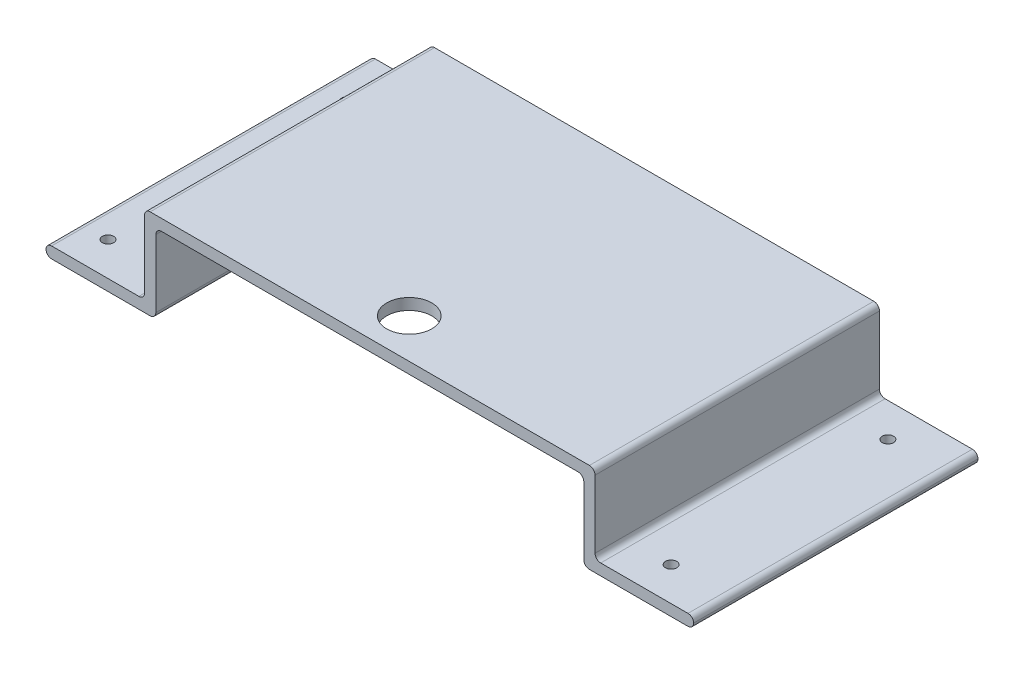
ISO-10303-21;
HEADER;
FILE_DESCRIPTION(('STEP AP214'),'2;1');
FILE_NAME('part.step','',(''),(''),'','','');
FILE_SCHEMA(('AUTOMOTIVE_DESIGN { 1 0 10303 214 1 1 1 1 }'));
ENDSEC;
DATA;
#1=APPLICATION_CONTEXT('core data for automotive mechanical design processes');
#2=APPLICATION_PROTOCOL_DEFINITION('international standard','automotive_design',2000,#1);
#3=PRODUCT_CONTEXT('',#1,'mechanical');
#4=PRODUCT('Part','Part','',(#3));
#5=PRODUCT_RELATED_PRODUCT_CATEGORY('part','',(#4));
#6=PRODUCT_DEFINITION_FORMATION('','',#4);
#7=PRODUCT_DEFINITION_CONTEXT('part definition',#1,'design');
#8=PRODUCT_DEFINITION('design','',#6,#7);
#9=PRODUCT_DEFINITION_SHAPE('','',#8);
#10=(LENGTH_UNIT() NAMED_UNIT(*) SI_UNIT(.MILLI.,.METRE.));
#11=(NAMED_UNIT(*) PLANE_ANGLE_UNIT() SI_UNIT($,.RADIAN.));
#12=(NAMED_UNIT(*) SI_UNIT($,.STERADIAN.) SOLID_ANGLE_UNIT());
#13=UNCERTAINTY_MEASURE_WITH_UNIT(LENGTH_MEASURE(1.E-05),#10,'distance_accuracy_value','');
#14=(GEOMETRIC_REPRESENTATION_CONTEXT(3) GLOBAL_UNCERTAINTY_ASSIGNED_CONTEXT((#13)) GLOBAL_UNIT_ASSIGNED_CONTEXT((#10,
#11,#12)) REPRESENTATION_CONTEXT('',''));
#15=CARTESIAN_POINT('',(0.,0.,0.));
#16=DIRECTION('',(0.,0.,1.));
#17=DIRECTION('',(1.,0.,0.));
#18=AXIS2_PLACEMENT_3D('',#15,#16,#17);
#19=CARTESIAN_POINT('',(0.,0.,-43.5));
#20=DIRECTION('',(0.,0.,1.));
#21=DIRECTION('',(1.,0.,0.));
#22=AXIS2_PLACEMENT_3D('',#19,#20,#21);
#23=PLANE('',#22);
#24=DIRECTION('',(1.,0.,0.));
#25=VECTOR('',#24,1.);
#26=CARTESIAN_POINT('',(0.,8.,-43.5));
#27=LINE('',#26,#25);
#28=CARTESIAN_POINT('',(49.,8.,-43.5));
#29=VERTEX_POINT('',#28);
#30=CARTESIAN_POINT('',(66.5,8.,-43.5));
#31=VERTEX_POINT('',#30);
#32=EDGE_CURVE('E367',#29,#31,#27,.T.);
#33=ORIENTED_EDGE('',*,*,#32,.F.);
#34=CARTESIAN_POINT('',(49.,9.,-43.5));
#35=DIRECTION('',(0.,0.,1.));
#36=DIRECTION('',(1.,0.,0.));
#37=AXIS2_PLACEMENT_3D('',#34,#35,#36);
#38=CIRCLE('',#37,1.);
#39=CARTESIAN_POINT('',(48.,9.,-43.5));
#40=VERTEX_POINT('',#39);
#41=EDGE_CURVE('E291',#29,#40,#38,.F.);
#42=ORIENTED_EDGE('',*,*,#41,.T.);
#43=DIRECTION('',(0.,-1.,0.));
#44=VECTOR('',#43,1.);
#45=CARTESIAN_POINT('',(48.,0.,-43.5));
#46=LINE('',#45,#44);
#47=CARTESIAN_POINT('',(48.,21.,-43.5));
#48=VERTEX_POINT('',#47);
#49=EDGE_CURVE('E428',#48,#40,#46,.T.);
#50=ORIENTED_EDGE('',*,*,#49,.F.);
#51=CARTESIAN_POINT('',(47.,21.,-43.5));
#52=DIRECTION('',(0.,0.,1.));
#53=DIRECTION('',(1.,0.,0.));
#54=AXIS2_PLACEMENT_3D('',#51,#52,#53);
#55=CIRCLE('',#54,1.);
#56=CARTESIAN_POINT('',(47.,22.,-43.5));
#57=VERTEX_POINT('',#56);
#58=EDGE_CURVE('E69',#48,#57,#55,.T.);
#59=ORIENTED_EDGE('',*,*,#58,.T.);
#60=DIRECTION('',(-1.,0.,0.));
#61=VECTOR('',#60,1.);
#62=CARTESIAN_POINT('',(0.,22.,-43.5));
#63=LINE('',#62,#61);
#64=CARTESIAN_POINT('',(-27.,22.,-43.5));
#65=VERTEX_POINT('',#64);
#66=EDGE_CURVE('E382',#57,#65,#63,.T.);
#67=ORIENTED_EDGE('',*,*,#66,.T.);
#68=CARTESIAN_POINT('',(-27.,21.,-43.5));
#69=DIRECTION('',(0.,0.,1.));
#70=DIRECTION('',(1.,0.,0.));
#71=AXIS2_PLACEMENT_3D('',#68,#69,#70);
#72=CIRCLE('',#71,1.);
#73=CARTESIAN_POINT('',(-28.,21.,-43.5));
#74=VERTEX_POINT('',#73);
#75=EDGE_CURVE('E321',#65,#74,#72,.T.);
#76=ORIENTED_EDGE('',*,*,#75,.T.);
#77=DIRECTION('',(0.,1.,0.));
#78=VECTOR('',#77,1.);
#79=CARTESIAN_POINT('',(-28.,0.,-43.5));
#80=LINE('',#79,#78);
#81=CARTESIAN_POINT('',(-28.,9.,-43.5));
#82=VERTEX_POINT('',#81);
#83=EDGE_CURVE('E380',#82,#74,#80,.T.);
#84=ORIENTED_EDGE('',*,*,#83,.F.);
#85=CARTESIAN_POINT('',(-29.,8.99999999999999,-43.5));
#86=DIRECTION('',(0.,0.,1.));
#87=DIRECTION('',(1.,0.,0.));
#88=AXIS2_PLACEMENT_3D('',#85,#86,#87);
#89=CIRCLE('',#88,1.);
#90=CARTESIAN_POINT('',(-29.,9.99999999999999,-43.5));
#91=VERTEX_POINT('',#90);
#92=EDGE_CURVE('E317',#82,#91,#89,.T.);
#93=ORIENTED_EDGE('',*,*,#92,.T.);
#94=DIRECTION('',(1.,0.,0.));
#95=VECTOR('',#94,1.);
#96=CARTESIAN_POINT('',(-30.,9.99999999999999,-43.5));
#97=LINE('',#96,#95);
#98=CARTESIAN_POINT('',(-31.,9.99999999999999,-43.5));
#99=VERTEX_POINT('',#98);
#100=EDGE_CURVE('E240',#99,#91,#97,.T.);
#101=ORIENTED_EDGE('',*,*,#100,.F.);
#102=CARTESIAN_POINT('',(-31.,11.,-43.5));
#103=DIRECTION('',(0.,0.,1.));
#104=DIRECTION('',(1.,0.,0.));
#105=AXIS2_PLACEMENT_3D('',#102,#103,#104);
#106=CIRCLE('',#105,1.);
#107=CARTESIAN_POINT('',(-30.,11.,-43.5));
#108=VERTEX_POINT('',#107);
#109=EDGE_CURVE('E325',#99,#108,#106,.T.);
#110=ORIENTED_EDGE('',*,*,#109,.T.);
#111=DIRECTION('',(0.,-1.,0.));
#112=VECTOR('',#111,1.);
#113=CARTESIAN_POINT('',(-30.,0.,-43.5));
#114=LINE('',#113,#112);
#115=CARTESIAN_POINT('',(-30.,23.,-43.5));
#116=VERTEX_POINT('',#115);
#117=EDGE_CURVE('E377',#116,#108,#114,.T.);
#118=ORIENTED_EDGE('',*,*,#117,.F.);
#119=CARTESIAN_POINT('',(-29.,23.,-43.5));
#120=DIRECTION('',(0.,0.,1.));
#121=DIRECTION('',(1.,0.,0.));
#122=AXIS2_PLACEMENT_3D('',#119,#120,#121);
#123=CIRCLE('',#122,1.);
#124=CARTESIAN_POINT('',(-29.,24.,-43.5));
#125=VERTEX_POINT('',#124);
#126=EDGE_CURVE('E285',#116,#125,#123,.F.);
#127=ORIENTED_EDGE('',*,*,#126,.T.);
#128=DIRECTION('',(-1.,0.,0.));
#129=VECTOR('',#128,1.);
#130=CARTESIAN_POINT('',(0.,24.,-43.5));
#131=LINE('',#130,#129);
#132=CARTESIAN_POINT('',(49.,24.,-43.5));
#133=VERTEX_POINT('',#132);
#134=EDGE_CURVE('E228',#133,#125,#131,.T.);
#135=ORIENTED_EDGE('',*,*,#134,.F.);
#136=CARTESIAN_POINT('',(49.,23.,-43.5));
#137=DIRECTION('',(0.,0.,1.));
#138=DIRECTION('',(1.,0.,0.));
#139=AXIS2_PLACEMENT_3D('',#136,#137,#138);
#140=CIRCLE('',#139,1.);
#141=CARTESIAN_POINT('',(50.,23.,-43.5));
#142=VERTEX_POINT('',#141);
#143=EDGE_CURVE('E283',#133,#142,#140,.F.);
#144=ORIENTED_EDGE('',*,*,#143,.T.);
#145=DIRECTION('',(0.,1.,0.));
#146=VECTOR('',#145,1.);
#147=CARTESIAN_POINT('',(50.,0.,-43.5));
#148=LINE('',#147,#146);
#149=CARTESIAN_POINT('',(50.,11.,-43.5));
#150=VERTEX_POINT('',#149);
#151=EDGE_CURVE('E426',#150,#142,#148,.T.);
#152=ORIENTED_EDGE('',*,*,#151,.F.);
#153=CARTESIAN_POINT('',(51.,11.,-43.5));
#154=DIRECTION('',(0.,0.,1.));
#155=DIRECTION('',(1.,0.,0.));
#156=AXIS2_PLACEMENT_3D('',#153,#154,#155);
#157=CIRCLE('',#156,1.);
#158=CARTESIAN_POINT('',(51.,10.,-43.5));
#159=VERTEX_POINT('',#158);
#160=EDGE_CURVE('E11',#150,#159,#157,.T.);
#161=ORIENTED_EDGE('',*,*,#160,.T.);
#162=DIRECTION('',(-1.,0.,0.));
#163=VECTOR('',#162,1.);
#164=CARTESIAN_POINT('',(0.,10.,-43.5));
#165=LINE('',#164,#163);
#166=CARTESIAN_POINT('',(66.5,10.,-43.5));
#167=VERTEX_POINT('',#166);
#168=EDGE_CURVE('E374',#167,#159,#165,.T.);
#169=ORIENTED_EDGE('',*,*,#168,.F.);
#170=CARTESIAN_POINT('',(66.5,9.,-43.5));
#171=DIRECTION('',(0.,0.,1.));
#172=DIRECTION('',(1.,0.,0.));
#173=AXIS2_PLACEMENT_3D('',#170,#171,#172);
#174=CIRCLE('',#173,1.);
#175=CARTESIAN_POINT('',(67.5,9.,-43.5));
#176=VERTEX_POINT('',#175);
#177=EDGE_CURVE('E287',#167,#176,#174,.F.);
#178=ORIENTED_EDGE('',*,*,#177,.T.);
#179=CARTESIAN_POINT('',(66.5,9.,-43.5));
#180=DIRECTION('',(0.,0.,1.));
#181=DIRECTION('',(1.,0.,0.));
#182=AXIS2_PLACEMENT_3D('',#179,#180,#181);
#183=CIRCLE('',#182,1.);
#184=EDGE_CURVE('E289',#176,#31,#183,.F.);
#185=ORIENTED_EDGE('',*,*,#184,.T.);
#186=EDGE_LOOP('',(#33,#42,#50,#59,#67,#76,#84,#93,#101,#110,#118,#127,#135,#144,#152,#161,#169,
#178,#185));
#187=FACE_BOUND('',#186,.T.);
#188=ADVANCED_FACE('F45',(#187),#23,.F.);
#189=CARTESIAN_POINT('',(0.,24.,0.));
#190=DIRECTION('',(0.,1.,0.));
#191=DIRECTION('',(0.,0.,1.));
#192=AXIS2_PLACEMENT_3D('',#189,#190,#191);
#193=PLANE('',#192);
#194=CARTESIAN_POINT('',(10.,24.,0.));
#195=DIRECTION('',(0.,1.,0.));
#196=DIRECTION('',(0.,0.,1.));
#197=AXIS2_PLACEMENT_3D('',#194,#195,#196);
#198=CIRCLE('',#197,4.);
#199=CARTESIAN_POINT('',(10.,24.,4.));
#200=VERTEX_POINT('',#199);
#201=EDGE_CURVE('E358',#200,#200,#198,.F.);
#202=ORIENTED_EDGE('',*,*,#201,.T.);
#203=EDGE_LOOP('',(#202));
#204=FACE_BOUND('',#203,.T.);
#205=ORIENTED_EDGE('',*,*,#134,.T.);
#206=DIRECTION('',(0.,0.,1.));
#207=VECTOR('',#206,1.);
#208=CARTESIAN_POINT('',(-29.,24.,0.));
#209=LINE('',#208,#207);
#210=CARTESIAN_POINT('',(-29.,24.,7.00000000000002));
#211=VERTEX_POINT('',#210);
#212=EDGE_CURVE('E304',#125,#211,#209,.T.);
#213=ORIENTED_EDGE('',*,*,#212,.T.);
#214=DIRECTION('',(1.,0.,0.));
#215=VECTOR('',#214,1.);
#216=CARTESIAN_POINT('',(0.,24.,7.00000000000001));
#217=LINE('',#216,#215);
#218=CARTESIAN_POINT('',(49.,24.,7.));
#219=VERTEX_POINT('',#218);
#220=EDGE_CURVE('E392',#211,#219,#217,.T.);
#221=ORIENTED_EDGE('',*,*,#220,.T.);
#222=DIRECTION('',(0.,0.,1.));
#223=VECTOR('',#222,1.);
#224=CARTESIAN_POINT('',(49.,24.,0.));
#225=LINE('',#224,#223);
#226=EDGE_CURVE('E302',#219,#133,#225,.F.);
#227=ORIENTED_EDGE('',*,*,#226,.T.);
#228=EDGE_LOOP('',(#205,#213,#221,#227));
#229=FACE_BOUND('',#228,.T.);
#230=ADVANCED_FACE('F466',(#204,#229),#193,.T.);
#231=CARTESIAN_POINT('',(0.,22.,0.));
#232=DIRECTION('',(0.,1.,0.));
#233=DIRECTION('',(0.,0.,1.));
#234=AXIS2_PLACEMENT_3D('',#231,#232,#233);
#235=PLANE('',#234);
#236=DIRECTION('',(1.,0.,0.));
#237=VECTOR('',#236,1.);
#238=CARTESIAN_POINT('',(0.,22.,7.00000000000001));
#239=LINE('',#238,#237);
#240=CARTESIAN_POINT('',(-27.,22.,7.00000000000002));
#241=VERTEX_POINT('',#240);
#242=CARTESIAN_POINT('',(47.,22.,7.));
#243=VERTEX_POINT('',#242);
#244=EDGE_CURVE('E384',#241,#243,#239,.T.);
#245=ORIENTED_EDGE('',*,*,#244,.F.);
#246=DIRECTION('',(0.,0.,1.));
#247=VECTOR('',#246,1.);
#248=CARTESIAN_POINT('',(-27.,22.,0.));
#249=LINE('',#248,#247);
#250=EDGE_CURVE('E62',#241,#65,#249,.F.);
#251=ORIENTED_EDGE('',*,*,#250,.T.);
#252=ORIENTED_EDGE('',*,*,#66,.F.);
#253=DIRECTION('',(0.,0.,1.));
#254=VECTOR('',#253,1.);
#255=CARTESIAN_POINT('',(47.,22.,0.));
#256=LINE('',#255,#254);
#257=EDGE_CURVE('E298',#57,#243,#256,.T.);
#258=ORIENTED_EDGE('',*,*,#257,.T.);
#259=EDGE_LOOP('',(#245,#251,#252,#258));
#260=FACE_BOUND('',#259,.T.);
#261=CARTESIAN_POINT('',(10.,22.,0.));
#262=DIRECTION('',(0.,1.,0.));
#263=DIRECTION('',(0.,0.,1.));
#264=AXIS2_PLACEMENT_3D('',#261,#262,#263);
#265=CIRCLE('',#264,4.);
#266=CARTESIAN_POINT('',(10.,22.,4.));
#267=VERTEX_POINT('',#266);
#268=EDGE_CURVE('E364',#267,#267,#265,.T.);
#269=ORIENTED_EDGE('',*,*,#268,.T.);
#270=EDGE_LOOP('',(#269));
#271=FACE_BOUND('',#270,.T.);
#272=ADVANCED_FACE('F447',(#260,#271),#235,.F.);
#273=CARTESIAN_POINT('',(0.,24.,7.00000000000001));
#274=DIRECTION('',(0.,0.,-1.));
#275=DIRECTION('',(-1.,0.,0.));
#276=AXIS2_PLACEMENT_3D('',#273,#274,#275);
#277=PLANE('',#276);
#278=CARTESIAN_POINT('',(-46.5,8.99999999999999,7.00000000000002));
#279=DIRECTION('',(0.,0.,-1.));
#280=DIRECTION('',(-1.,0.,0.));
#281=AXIS2_PLACEMENT_3D('',#278,#279,#280);
#282=CIRCLE('',#281,1.);
#283=CARTESIAN_POINT('',(-46.5,9.99999999999999,7.00000000000001));
#284=VERTEX_POINT('',#283);
#285=CARTESIAN_POINT('',(-47.5,8.99999999999999,7.00000000000001));
#286=VERTEX_POINT('',#285);
#287=EDGE_CURVE('E216',#284,#286,#282,.F.);
#288=ORIENTED_EDGE('',*,*,#287,.T.);
#289=CARTESIAN_POINT('',(-46.5,9.,7.00000000000002));
#290=DIRECTION('',(0.,0.,-1.));
#291=DIRECTION('',(-1.,0.,0.));
#292=AXIS2_PLACEMENT_3D('',#289,#290,#291);
#293=CIRCLE('',#292,1.);
#294=CARTESIAN_POINT('',(-46.5,8.,7.00000000000001));
#295=VERTEX_POINT('',#294);
#296=EDGE_CURVE('E266',#286,#295,#293,.F.);
#297=ORIENTED_EDGE('',*,*,#296,.T.);
#298=DIRECTION('',(1.,0.,0.));
#299=VECTOR('',#298,1.);
#300=CARTESIAN_POINT('',(0.,8.,7.00000000000001));
#301=LINE('',#300,#299);
#302=CARTESIAN_POINT('',(-29.,8.,7.00000000000001));
#303=VERTEX_POINT('',#302);
#304=EDGE_CURVE('E212',#295,#303,#301,.T.);
#305=ORIENTED_EDGE('',*,*,#304,.T.);
#306=CARTESIAN_POINT('',(-29.,9.,7.00000000000002));
#307=DIRECTION('',(0.,0.,-1.));
#308=DIRECTION('',(-1.,0.,0.));
#309=AXIS2_PLACEMENT_3D('',#306,#307,#308);
#310=CIRCLE('',#309,1.);
#311=CARTESIAN_POINT('',(-28.,9.,7.00000000000001));
#312=VERTEX_POINT('',#311);
#313=EDGE_CURVE('E207',#303,#312,#310,.F.);
#314=ORIENTED_EDGE('',*,*,#313,.T.);
#315=DIRECTION('',(0.,1.,0.));
#316=VECTOR('',#315,1.);
#317=CARTESIAN_POINT('',(-28.,0.,7.00000000000001));
#318=LINE('',#317,#316);
#319=CARTESIAN_POINT('',(-28.,21.,7.00000000000001));
#320=VERTEX_POINT('',#319);
#321=EDGE_CURVE('E210',#312,#320,#318,.T.);
#322=ORIENTED_EDGE('',*,*,#321,.T.);
#323=CARTESIAN_POINT('',(-27.,21.,7.00000000000002));
#324=DIRECTION('',(0.,0.,-1.));
#325=DIRECTION('',(-1.,0.,0.));
#326=AXIS2_PLACEMENT_3D('',#323,#324,#325);
#327=CIRCLE('',#326,1.);
#328=EDGE_CURVE('E319',#320,#241,#327,.T.);
#329=ORIENTED_EDGE('',*,*,#328,.T.);
#330=ORIENTED_EDGE('',*,*,#244,.T.);
#331=CARTESIAN_POINT('',(47.,21.,7.));
#332=DIRECTION('',(0.,0.,-1.));
#333=DIRECTION('',(-1.,0.,0.));
#334=AXIS2_PLACEMENT_3D('',#331,#332,#333);
#335=CIRCLE('',#334,1.);
#336=CARTESIAN_POINT('',(48.,21.,7.00000000000001));
#337=VERTEX_POINT('',#336);
#338=EDGE_CURVE('E327',#243,#337,#335,.T.);
#339=ORIENTED_EDGE('',*,*,#338,.T.);
#340=DIRECTION('',(0.,-1.,0.));
#341=VECTOR('',#340,1.);
#342=CARTESIAN_POINT('',(48.,0.,7.00000000000001));
#343=LINE('',#342,#341);
#344=CARTESIAN_POINT('',(48.,9.,7.00000000000001));
#345=VERTEX_POINT('',#344);
#346=EDGE_CURVE('E361',#337,#345,#343,.T.);
#347=ORIENTED_EDGE('',*,*,#346,.T.);
#348=CARTESIAN_POINT('',(49.,9.,7.00000000000001));
#349=DIRECTION('',(0.,0.,-1.));
#350=DIRECTION('',(-1.,0.,0.));
#351=AXIS2_PLACEMENT_3D('',#348,#349,#350);
#352=CIRCLE('',#351,1.);
#353=CARTESIAN_POINT('',(49.,8.,7.00000000000001));
#354=VERTEX_POINT('',#353);
#355=EDGE_CURVE('E217',#345,#354,#352,.F.);
#356=ORIENTED_EDGE('',*,*,#355,.T.);
#357=DIRECTION('',(1.,0.,0.));
#358=VECTOR('',#357,1.);
#359=CARTESIAN_POINT('',(0.,8.,7.00000000000001));
#360=LINE('',#359,#358);
#361=CARTESIAN_POINT('',(66.5,8.,7.00000000000001));
#362=VERTEX_POINT('',#361);
#363=EDGE_CURVE('E372',#354,#362,#360,.T.);
#364=ORIENTED_EDGE('',*,*,#363,.T.);
#365=CARTESIAN_POINT('',(66.5,9.,7.));
#366=DIRECTION('',(0.,0.,-1.));
#367=DIRECTION('',(-1.,0.,0.));
#368=AXIS2_PLACEMENT_3D('',#365,#366,#367);
#369=CIRCLE('',#368,1.);
#370=CARTESIAN_POINT('',(67.5,9.,7.00000000000001));
#371=VERTEX_POINT('',#370);
#372=EDGE_CURVE('E262',#362,#371,#369,.F.);
#373=ORIENTED_EDGE('',*,*,#372,.T.);
#374=CARTESIAN_POINT('',(66.5,9.,7.));
#375=DIRECTION('',(0.,0.,-1.));
#376=DIRECTION('',(-1.,0.,0.));
#377=AXIS2_PLACEMENT_3D('',#374,#375,#376);
#378=CIRCLE('',#377,1.);
#379=CARTESIAN_POINT('',(66.5,10.,7.00000000000001));
#380=VERTEX_POINT('',#379);
#381=EDGE_CURVE('E260',#371,#380,#378,.F.);
#382=ORIENTED_EDGE('',*,*,#381,.T.);
#383=DIRECTION('',(-1.,0.,0.));
#384=VECTOR('',#383,1.);
#385=CARTESIAN_POINT('',(0.,10.,7.00000000000001));
#386=LINE('',#385,#384);
#387=CARTESIAN_POINT('',(51.,10.,7.00000000000001));
#388=VERTEX_POINT('',#387);
#389=EDGE_CURVE('E350',#380,#388,#386,.T.);
#390=ORIENTED_EDGE('',*,*,#389,.T.);
#391=CARTESIAN_POINT('',(51.,11.,7.00000000000001));
#392=DIRECTION('',(0.,0.,-1.));
#393=DIRECTION('',(-1.,0.,0.));
#394=AXIS2_PLACEMENT_3D('',#391,#392,#393);
#395=CIRCLE('',#394,1.);
#396=CARTESIAN_POINT('',(50.,11.,7.00000000000001));
#397=VERTEX_POINT('',#396);
#398=EDGE_CURVE('E54',#388,#397,#395,.T.);
#399=ORIENTED_EDGE('',*,*,#398,.T.);
#400=DIRECTION('',(0.,1.,0.));
#401=VECTOR('',#400,1.);
#402=CARTESIAN_POINT('',(50.,0.,7.00000000000001));
#403=LINE('',#402,#401);
#404=CARTESIAN_POINT('',(50.,23.,7.00000000000001));
#405=VERTEX_POINT('',#404);
#406=EDGE_CURVE('E357',#397,#405,#403,.T.);
#407=ORIENTED_EDGE('',*,*,#406,.T.);
#408=CARTESIAN_POINT('',(49.,23.,7.00000000000001));
#409=DIRECTION('',(0.,0.,-1.));
#410=DIRECTION('',(-1.,0.,0.));
#411=AXIS2_PLACEMENT_3D('',#408,#409,#410);
#412=CIRCLE('',#411,1.);
#413=EDGE_CURVE('E256',#405,#219,#412,.F.);
#414=ORIENTED_EDGE('',*,*,#413,.T.);
#415=ORIENTED_EDGE('',*,*,#220,.F.);
#416=CARTESIAN_POINT('',(-29.,23.,7.00000000000002));
#417=DIRECTION('',(0.,0.,-1.));
#418=DIRECTION('',(-1.,0.,0.));
#419=AXIS2_PLACEMENT_3D('',#416,#417,#418);
#420=CIRCLE('',#419,1.);
#421=CARTESIAN_POINT('',(-30.,23.,7.00000000000001));
#422=VERTEX_POINT('',#421);
#423=EDGE_CURVE('E258',#211,#422,#420,.F.);
#424=ORIENTED_EDGE('',*,*,#423,.T.);
#425=DIRECTION('',(0.,-1.,0.));
#426=VECTOR('',#425,1.);
#427=CARTESIAN_POINT('',(-30.,0.,7.00000000000001));
#428=LINE('',#427,#426);
#429=CARTESIAN_POINT('',(-30.,11.,7.00000000000001));
#430=VERTEX_POINT('',#429);
#431=EDGE_CURVE('E385',#422,#430,#428,.T.);
#432=ORIENTED_EDGE('',*,*,#431,.T.);
#433=CARTESIAN_POINT('',(-31.,11.,7.00000000000002));
#434=DIRECTION('',(0.,0.,-1.));
#435=DIRECTION('',(-1.,0.,0.));
#436=AXIS2_PLACEMENT_3D('',#433,#434,#435);
#437=CIRCLE('',#436,1.);
#438=CARTESIAN_POINT('',(-31.,9.99999999999999,7.00000000000001));
#439=VERTEX_POINT('',#438);
#440=EDGE_CURVE('E323',#430,#439,#437,.T.);
#441=ORIENTED_EDGE('',*,*,#440,.T.);
#442=DIRECTION('',(-1.,0.,0.));
#443=VECTOR('',#442,1.);
#444=CARTESIAN_POINT('',(0.,10.,7.00000000000001));
#445=LINE('',#444,#443);
#446=EDGE_CURVE('E388',#439,#284,#445,.T.);
#447=ORIENTED_EDGE('',*,*,#446,.T.);
#448=EDGE_LOOP('',(#288,#297,#305,#314,#322,#329,#330,#339,#347,#356,#364,#373,#382,#390,#399,
#407,#414,#415,#424,#432,#441,#447));
#449=FACE_BOUND('',#448,.T.);
#450=ADVANCED_FACE('F209',(#449),#277,.F.);
#451=CARTESIAN_POINT('',(-28.,0.,-43.5));
#452=DIRECTION('',(1.,0.,0.));
#453=DIRECTION('',(0.,1.,0.));
#454=AXIS2_PLACEMENT_3D('',#451,#452,#453);
#455=PLANE('',#454);
#456=DIRECTION('',(0.,0.,1.));
#457=VECTOR('',#456,1.);
#458=CARTESIAN_POINT('',(-28.,9.,-43.5));
#459=LINE('',#458,#457);
#460=EDGE_CURVE('E224',#312,#82,#459,.F.);
#461=ORIENTED_EDGE('',*,*,#460,.T.);
#462=ORIENTED_EDGE('',*,*,#83,.T.);
#463=DIRECTION('',(0.,0.,1.));
#464=VECTOR('',#463,1.);
#465=CARTESIAN_POINT('',(-28.,21.,-43.5));
#466=LINE('',#465,#464);
#467=EDGE_CURVE('E227',#74,#320,#466,.T.);
#468=ORIENTED_EDGE('',*,*,#467,.T.);
#469=ORIENTED_EDGE('',*,*,#321,.F.);
#470=EDGE_LOOP('',(#461,#462,#468,#469));
#471=FACE_BOUND('',#470,.T.);
#472=ADVANCED_FACE('F222',(#471),#455,.T.);
#473=CARTESIAN_POINT('',(0.,8.,-43.5));
#474=DIRECTION('',(0.,-1.,0.));
#475=DIRECTION('',(1.,0.,0.));
#476=AXIS2_PLACEMENT_3D('',#473,#474,#475);
#477=PLANE('',#476);
#478=CARTESIAN_POINT('',(-42.5,8.,-41.5));
#479=DIRECTION('',(0.,-1.,0.));
#480=DIRECTION('',(0.,0.,-1.));
#481=AXIS2_PLACEMENT_3D('',#478,#479,#480);
#482=CIRCLE('',#481,0.999999999999998);
#483=CARTESIAN_POINT('',(-42.5,8.,-42.5));
#484=VERTEX_POINT('',#483);
#485=EDGE_CURVE('E331',#484,#484,#482,.T.);
#486=ORIENTED_EDGE('',*,*,#485,.F.);
#487=EDGE_LOOP('',(#486));
#488=FACE_BOUND('',#487,.T.);
#489=CARTESIAN_POINT('',(-42.5,8.,1.00000000000001));
#490=DIRECTION('',(0.,-1.,0.));
#491=DIRECTION('',(0.,0.,-1.));
#492=AXIS2_PLACEMENT_3D('',#489,#490,#491);
#493=CIRCLE('',#492,0.999999999999998);
#494=CARTESIAN_POINT('',(-42.5,8.,0.));
#495=VERTEX_POINT('',#494);
#496=EDGE_CURVE('E736',#495,#495,#493,.T.);
#497=ORIENTED_EDGE('',*,*,#496,.F.);
#498=EDGE_LOOP('',(#497));
#499=FACE_BOUND('',#498,.T.);
#500=ORIENTED_EDGE('',*,*,#304,.F.);
#501=DIRECTION('',(0.,0.,1.));
#502=VECTOR('',#501,1.);
#503=CARTESIAN_POINT('',(-46.5,8.,-43.5));
#504=LINE('',#503,#502);
#505=CARTESIAN_POINT('',(-46.5,8.,-50.5));
#506=VERTEX_POINT('',#505);
#507=EDGE_CURVE('E270',#295,#506,#504,.F.);
#508=ORIENTED_EDGE('',*,*,#507,.T.);
#509=DIRECTION('',(-1.,0.,0.));
#510=VECTOR('',#509,1.);
#511=CARTESIAN_POINT('',(-47.5,8.,-50.5));
#512=LINE('',#511,#510);
#513=CARTESIAN_POINT('',(-29.,8.,-50.5));
#514=VERTEX_POINT('',#513);
#515=EDGE_CURVE('E412',#514,#506,#512,.T.);
#516=ORIENTED_EDGE('',*,*,#515,.F.);
#517=DIRECTION('',(0.,0.,1.));
#518=VECTOR('',#517,1.);
#519=CARTESIAN_POINT('',(-29.,8.,-43.5));
#520=LINE('',#519,#518);
#521=EDGE_CURVE('E268',#514,#303,#520,.T.);
#522=ORIENTED_EDGE('',*,*,#521,.T.);
#523=EDGE_LOOP('',(#500,#508,#516,#522));
#524=FACE_BOUND('',#523,.T.);
#525=ADVANCED_FACE('F480',(#488,#499,#524),#477,.T.);
#526=CARTESIAN_POINT('',(0.,10.,-43.5));
#527=DIRECTION('',(0.,1.,0.));
#528=DIRECTION('',(-1.,0.,0.));
#529=AXIS2_PLACEMENT_3D('',#526,#527,#528);
#530=PLANE('',#529);
#531=CARTESIAN_POINT('',(-42.5,9.99999999999999,-41.5));
#532=DIRECTION('',(0.,1.,0.));
#533=DIRECTION('',(-1.,0.,0.));
#534=AXIS2_PLACEMENT_3D('',#531,#532,#533);
#535=CIRCLE('',#534,0.999999999999998);
#536=CARTESIAN_POINT('',(-43.5,9.99999999999999,-41.5));
#537=VERTEX_POINT('',#536);
#538=EDGE_CURVE('E406',#537,#537,#535,.T.);
#539=ORIENTED_EDGE('',*,*,#538,.F.);
#540=EDGE_LOOP('',(#539));
#541=FACE_BOUND('',#540,.T.);
#542=CARTESIAN_POINT('',(-42.5,9.99999999999999,1.00000000000001));
#543=DIRECTION('',(0.,1.,0.));
#544=DIRECTION('',(-1.,0.,0.));
#545=AXIS2_PLACEMENT_3D('',#542,#543,#544);
#546=CIRCLE('',#545,0.999999999999998);
#547=CARTESIAN_POINT('',(-43.5,9.99999999999999,1.00000000000001));
#548=VERTEX_POINT('',#547);
#549=EDGE_CURVE('E404',#548,#548,#546,.T.);
#550=ORIENTED_EDGE('',*,*,#549,.F.);
#551=EDGE_LOOP('',(#550));
#552=FACE_BOUND('',#551,.T.);
#553=ORIENTED_EDGE('',*,*,#100,.T.);
#554=DIRECTION('',(0.,0.,1.));
#555=VECTOR('',#554,1.);
#556=CARTESIAN_POINT('',(-29.,9.99999999999999,-43.5));
#557=LINE('',#556,#555);
#558=CARTESIAN_POINT('',(-29.,9.99999999999999,-50.5));
#559=VERTEX_POINT('',#558);
#560=EDGE_CURVE('E245',#91,#559,#557,.F.);
#561=ORIENTED_EDGE('',*,*,#560,.T.);
#562=DIRECTION('',(1.,0.,0.));
#563=VECTOR('',#562,1.);
#564=CARTESIAN_POINT('',(-30.,9.99999999999999,-50.5));
#565=LINE('',#564,#563);
#566=CARTESIAN_POINT('',(-46.5,9.99999999999999,-50.5));
#567=VERTEX_POINT('',#566);
#568=EDGE_CURVE('E408',#567,#559,#565,.T.);
#569=ORIENTED_EDGE('',*,*,#568,.F.);
#570=DIRECTION('',(0.,0.,1.));
#571=VECTOR('',#570,1.);
#572=CARTESIAN_POINT('',(-46.5,9.99999999999999,-43.5));
#573=LINE('',#572,#571);
#574=EDGE_CURVE('E238',#567,#284,#573,.T.);
#575=ORIENTED_EDGE('',*,*,#574,.T.);
#576=ORIENTED_EDGE('',*,*,#446,.F.);
#577=DIRECTION('',(0.,0.,1.));
#578=VECTOR('',#577,1.);
#579=CARTESIAN_POINT('',(-31.,9.99999999999999,-43.5));
#580=LINE('',#579,#578);
#581=EDGE_CURVE('E235',#439,#99,#580,.F.);
#582=ORIENTED_EDGE('',*,*,#581,.T.);
#583=EDGE_LOOP('',(#553,#561,#569,#575,#576,#582));
#584=FACE_BOUND('',#583,.T.);
#585=ADVANCED_FACE('F483',(#541,#552,#584),#530,.T.);
#586=CARTESIAN_POINT('',(-30.,0.,-43.5));
#587=DIRECTION('',(-1.,0.,0.));
#588=DIRECTION('',(0.,0.,1.));
#589=AXIS2_PLACEMENT_3D('',#586,#587,#588);
#590=PLANE('',#589);
#591=ORIENTED_EDGE('',*,*,#431,.F.);
#592=DIRECTION('',(0.,0.,1.));
#593=VECTOR('',#592,1.);
#594=CARTESIAN_POINT('',(-30.,23.,-43.5));
#595=LINE('',#594,#593);
#596=EDGE_CURVE('E310',#422,#116,#595,.F.);
#597=ORIENTED_EDGE('',*,*,#596,.T.);
#598=ORIENTED_EDGE('',*,*,#117,.T.);
#599=DIRECTION('',(0.,0.,1.));
#600=VECTOR('',#599,1.);
#601=CARTESIAN_POINT('',(-30.,11.,7.00000000000001));
#602=LINE('',#601,#600);
#603=EDGE_CURVE('E307',#108,#430,#602,.T.);
#604=ORIENTED_EDGE('',*,*,#603,.T.);
#605=EDGE_LOOP('',(#591,#597,#598,#604));
#606=FACE_BOUND('',#605,.T.);
#607=ADVANCED_FACE('F487',(#606),#590,.T.);
#608=CARTESIAN_POINT('',(50.,0.,-43.5));
#609=DIRECTION('',(1.,0.,0.));
#610=DIRECTION('',(0.,0.,-1.));
#611=AXIS2_PLACEMENT_3D('',#608,#609,#610);
#612=PLANE('',#611);
#613=ORIENTED_EDGE('',*,*,#151,.T.);
#614=DIRECTION('',(0.,0.,1.));
#615=VECTOR('',#614,1.);
#616=CARTESIAN_POINT('',(50.,23.,-43.5));
#617=LINE('',#616,#615);
#618=EDGE_CURVE('E314',#142,#405,#617,.T.);
#619=ORIENTED_EDGE('',*,*,#618,.T.);
#620=ORIENTED_EDGE('',*,*,#406,.F.);
#621=DIRECTION('',(0.,0.,1.));
#622=VECTOR('',#621,1.);
#623=CARTESIAN_POINT('',(50.,11.,-43.5));
#624=LINE('',#623,#622);
#625=EDGE_CURVE('E312',#397,#150,#624,.F.);
#626=ORIENTED_EDGE('',*,*,#625,.T.);
#627=EDGE_LOOP('',(#613,#619,#620,#626));
#628=FACE_BOUND('',#627,.T.);
#629=ADVANCED_FACE('F490',(#628),#612,.T.);
#630=CARTESIAN_POINT('',(48.,0.,-43.5));
#631=DIRECTION('',(-1.,0.,0.));
#632=DIRECTION('',(0.,0.,1.));
#633=AXIS2_PLACEMENT_3D('',#630,#631,#632);
#634=PLANE('',#633);
#635=ORIENTED_EDGE('',*,*,#49,.T.);
#636=DIRECTION('',(0.,0.,1.));
#637=VECTOR('',#636,1.);
#638=CARTESIAN_POINT('',(48.,9.,-43.5));
#639=LINE('',#638,#637);
#640=EDGE_CURVE('E275',#40,#345,#639,.T.);
#641=ORIENTED_EDGE('',*,*,#640,.T.);
#642=ORIENTED_EDGE('',*,*,#346,.F.);
#643=DIRECTION('',(0.,0.,1.));
#644=VECTOR('',#643,1.);
#645=CARTESIAN_POINT('',(48.,21.,-43.5));
#646=LINE('',#645,#644);
#647=EDGE_CURVE('E273',#337,#48,#646,.F.);
#648=ORIENTED_EDGE('',*,*,#647,.T.);
#649=EDGE_LOOP('',(#635,#641,#642,#648));
#650=FACE_BOUND('',#649,.T.);
#651=ADVANCED_FACE('F442',(#650),#634,.T.);
#652=CARTESIAN_POINT('',(0.,8.,-43.5));
#653=DIRECTION('',(0.,-1.,0.));
#654=DIRECTION('',(1.,0.,0.));
#655=AXIS2_PLACEMENT_3D('',#652,#653,#654);
#656=PLANE('',#655);
#657=CARTESIAN_POINT('',(57.5,8.,-37.5));
#658=DIRECTION('',(0.,-1.,0.));
#659=DIRECTION('',(0.,0.,-1.));
#660=AXIS2_PLACEMENT_3D('',#657,#658,#659);
#661=CIRCLE('',#660,0.999999999999998);
#662=CARTESIAN_POINT('',(57.5,8.,-38.5));
#663=VERTEX_POINT('',#662);
#664=EDGE_CURVE('E738',#663,#663,#661,.T.);
#665=ORIENTED_EDGE('',*,*,#664,.F.);
#666=EDGE_LOOP('',(#665));
#667=FACE_BOUND('',#666,.T.);
#668=CARTESIAN_POINT('',(57.5,8.,1.00000000000001));
#669=DIRECTION('',(0.,-1.,0.));
#670=DIRECTION('',(0.,0.,-1.));
#671=AXIS2_PLACEMENT_3D('',#668,#669,#670);
#672=CIRCLE('',#671,0.999999999999998);
#673=CARTESIAN_POINT('',(57.5,8.,0.));
#674=VERTEX_POINT('',#673);
#675=EDGE_CURVE('E401',#674,#674,#672,.T.);
#676=ORIENTED_EDGE('',*,*,#675,.F.);
#677=EDGE_LOOP('',(#676));
#678=FACE_BOUND('',#677,.T.);
#679=ORIENTED_EDGE('',*,*,#363,.F.);
#680=DIRECTION('',(0.,0.,1.));
#681=VECTOR('',#680,1.);
#682=CARTESIAN_POINT('',(49.,8.,-43.5));
#683=LINE('',#682,#681);
#684=EDGE_CURVE('E281',#354,#29,#683,.F.);
#685=ORIENTED_EDGE('',*,*,#684,.T.);
#686=ORIENTED_EDGE('',*,*,#32,.T.);
#687=DIRECTION('',(0.,0.,1.));
#688=VECTOR('',#687,1.);
#689=CARTESIAN_POINT('',(66.5,8.,-43.5));
#690=LINE('',#689,#688);
#691=EDGE_CURVE('E278',#31,#362,#690,.T.);
#692=ORIENTED_EDGE('',*,*,#691,.T.);
#693=EDGE_LOOP('',(#679,#685,#686,#692));
#694=FACE_BOUND('',#693,.T.);
#695=ADVANCED_FACE('F436',(#667,#678,#694),#656,.T.);
#696=CARTESIAN_POINT('',(0.,10.,-43.5));
#697=DIRECTION('',(0.,1.,0.));
#698=DIRECTION('',(0.,0.,1.));
#699=AXIS2_PLACEMENT_3D('',#696,#697,#698);
#700=PLANE('',#699);
#701=CARTESIAN_POINT('',(57.5,10.,-37.5));
#702=DIRECTION('',(0.,1.,0.));
#703=DIRECTION('',(0.,0.,1.));
#704=AXIS2_PLACEMENT_3D('',#701,#702,#703);
#705=CIRCLE('',#704,0.999999999999998);
#706=CARTESIAN_POINT('',(57.5,10.,-36.5));
#707=VERTEX_POINT('',#706);
#708=EDGE_CURVE('E400',#707,#707,#705,.T.);
#709=ORIENTED_EDGE('',*,*,#708,.F.);
#710=EDGE_LOOP('',(#709));
#711=FACE_BOUND('',#710,.T.);
#712=CARTESIAN_POINT('',(57.5,10.,1.00000000000001));
#713=DIRECTION('',(0.,1.,0.));
#714=DIRECTION('',(0.,0.,1.));
#715=AXIS2_PLACEMENT_3D('',#712,#713,#714);
#716=CIRCLE('',#715,0.999999999999998);
#717=CARTESIAN_POINT('',(57.5,10.,2.00000000000001));
#718=VERTEX_POINT('',#717);
#719=EDGE_CURVE('E397',#718,#718,#716,.T.);
#720=ORIENTED_EDGE('',*,*,#719,.F.);
#721=EDGE_LOOP('',(#720));
#722=FACE_BOUND('',#721,.T.);
#723=ORIENTED_EDGE('',*,*,#389,.F.);
#724=DIRECTION('',(0.,0.,1.));
#725=VECTOR('',#724,1.);
#726=CARTESIAN_POINT('',(66.5,10.,-43.5));
#727=LINE('',#726,#725);
#728=EDGE_CURVE('E296',#380,#167,#727,.F.);
#729=ORIENTED_EDGE('',*,*,#728,.T.);
#730=ORIENTED_EDGE('',*,*,#168,.T.);
#731=DIRECTION('',(0.,0.,1.));
#732=VECTOR('',#731,1.);
#733=CARTESIAN_POINT('',(51.,10.,7.00000000000001));
#734=LINE('',#733,#732);
#735=EDGE_CURVE('E293',#159,#388,#734,.T.);
#736=ORIENTED_EDGE('',*,*,#735,.T.);
#737=EDGE_LOOP('',(#723,#729,#730,#736));
#738=FACE_BOUND('',#737,.T.);
#739=ADVANCED_FACE('F353',(#711,#722,#738),#700,.T.);
#740=CARTESIAN_POINT('',(10.,35.,0.));
#741=DIRECTION('',(0.,-1.,0.));
#742=DIRECTION('',(0.,0.,-1.));
#743=AXIS2_PLACEMENT_3D('',#740,#741,#742);
#744=CYLINDRICAL_SURFACE('',#743,4.);
#745=ORIENTED_EDGE('',*,*,#201,.F.);
#746=EDGE_LOOP('',(#745));
#747=FACE_BOUND('',#746,.T.);
#748=ORIENTED_EDGE('',*,*,#268,.F.);
#749=EDGE_LOOP('',(#748));
#750=FACE_BOUND('',#749,.T.);
#751=ADVANCED_FACE('F652',(#747,#750),#744,.F.);
#752=CARTESIAN_POINT('',(0.,0.,-50.5));
#753=DIRECTION('',(0.,0.,1.));
#754=DIRECTION('',(1.,0.,0.));
#755=AXIS2_PLACEMENT_3D('',#752,#753,#754);
#756=PLANE('',#755);
#757=ORIENTED_EDGE('',*,*,#515,.T.);
#758=CARTESIAN_POINT('',(-46.5,9.,-50.5));
#759=DIRECTION('',(0.,0.,1.));
#760=DIRECTION('',(1.,0.,0.));
#761=AXIS2_PLACEMENT_3D('',#758,#759,#760);
#762=CIRCLE('',#761,1.);
#763=CARTESIAN_POINT('',(-47.5,8.99999999999999,-50.5));
#764=VERTEX_POINT('',#763);
#765=EDGE_CURVE('E254',#506,#764,#762,.F.);
#766=ORIENTED_EDGE('',*,*,#765,.T.);
#767=CARTESIAN_POINT('',(-46.5,8.99999999999999,-50.5));
#768=DIRECTION('',(0.,0.,1.));
#769=DIRECTION('',(1.,0.,0.));
#770=AXIS2_PLACEMENT_3D('',#767,#768,#769);
#771=CIRCLE('',#770,1.);
#772=EDGE_CURVE('E252',#764,#567,#771,.F.);
#773=ORIENTED_EDGE('',*,*,#772,.T.);
#774=ORIENTED_EDGE('',*,*,#568,.T.);
#775=CARTESIAN_POINT('',(-29.,8.99999999999999,-50.5));
#776=DIRECTION('',(0.,0.,1.));
#777=DIRECTION('',(1.,0.,0.));
#778=AXIS2_PLACEMENT_3D('',#775,#776,#777);
#779=CIRCLE('',#778,1.);
#780=CARTESIAN_POINT('',(-28.,9.,-50.5));
#781=VERTEX_POINT('',#780);
#782=EDGE_CURVE('E250',#559,#781,#779,.F.);
#783=ORIENTED_EDGE('',*,*,#782,.T.);
#784=CARTESIAN_POINT('',(-29.,9.,-50.5));
#785=DIRECTION('',(0.,0.,1.));
#786=DIRECTION('',(1.,0.,0.));
#787=AXIS2_PLACEMENT_3D('',#784,#785,#786);
#788=CIRCLE('',#787,1.);
#789=EDGE_CURVE('E248',#781,#514,#788,.F.);
#790=ORIENTED_EDGE('',*,*,#789,.T.);
#791=EDGE_LOOP('',(#757,#766,#773,#774,#783,#790));
#792=FACE_BOUND('',#791,.T.);
#793=ADVANCED_FACE('F647',(#792),#756,.F.);
#794=CARTESIAN_POINT('',(57.5,18.,1.00000000000001));
#795=DIRECTION('',(0.,-1.,0.));
#796=DIRECTION('',(0.,0.,-1.));
#797=AXIS2_PLACEMENT_3D('',#794,#795,#796);
#798=CYLINDRICAL_SURFACE('',#797,0.999999999999998);
#799=ORIENTED_EDGE('',*,*,#719,.T.);
#800=EDGE_LOOP('',(#799));
#801=FACE_BOUND('',#800,.T.);
#802=ORIENTED_EDGE('',*,*,#675,.T.);
#803=EDGE_LOOP('',(#802));
#804=FACE_BOUND('',#803,.T.);
#805=ADVANCED_FACE('F651',(#801,#804),#798,.F.);
#806=CARTESIAN_POINT('',(57.5,18.,-37.5));
#807=DIRECTION('',(0.,-1.,0.));
#808=DIRECTION('',(0.,0.,-1.));
#809=AXIS2_PLACEMENT_3D('',#806,#807,#808);
#810=CYLINDRICAL_SURFACE('',#809,0.999999999999998);
#811=ORIENTED_EDGE('',*,*,#708,.T.);
#812=EDGE_LOOP('',(#811));
#813=FACE_BOUND('',#812,.T.);
#814=ORIENTED_EDGE('',*,*,#664,.T.);
#815=EDGE_LOOP('',(#814));
#816=FACE_BOUND('',#815,.T.);
#817=ADVANCED_FACE('F659',(#813,#816),#810,.F.);
#818=CARTESIAN_POINT('',(-42.5,18.,1.00000000000001));
#819=DIRECTION('',(0.,-1.,0.));
#820=DIRECTION('',(0.,0.,-1.));
#821=AXIS2_PLACEMENT_3D('',#818,#819,#820);
#822=CYLINDRICAL_SURFACE('',#821,0.999999999999998);
#823=ORIENTED_EDGE('',*,*,#549,.T.);
#824=EDGE_LOOP('',(#823));
#825=FACE_BOUND('',#824,.T.);
#826=ORIENTED_EDGE('',*,*,#496,.T.);
#827=EDGE_LOOP('',(#826));
#828=FACE_BOUND('',#827,.T.);
#829=ADVANCED_FACE('F698',(#825,#828),#822,.F.);
#830=CARTESIAN_POINT('',(-42.5,18.,-41.5));
#831=DIRECTION('',(0.,-1.,0.));
#832=DIRECTION('',(0.,0.,-1.));
#833=AXIS2_PLACEMENT_3D('',#830,#831,#832);
#834=CYLINDRICAL_SURFACE('',#833,0.999999999999998);
#835=ORIENTED_EDGE('',*,*,#538,.T.);
#836=EDGE_LOOP('',(#835));
#837=FACE_BOUND('',#836,.T.);
#838=ORIENTED_EDGE('',*,*,#485,.T.);
#839=EDGE_LOOP('',(#838));
#840=FACE_BOUND('',#839,.T.);
#841=ADVANCED_FACE('F504',(#837,#840),#834,.F.);
#842=CARTESIAN_POINT('',(-29.,9.,-43.5));
#843=DIRECTION('',(0.,0.,1.));
#844=DIRECTION('',(1.,0.,0.));
#845=AXIS2_PLACEMENT_3D('',#842,#843,#844);
#846=CYLINDRICAL_SURFACE('',#845,1.);
#847=ORIENTED_EDGE('',*,*,#521,.F.);
#848=ORIENTED_EDGE('',*,*,#789,.F.);
#849=DIRECTION('',(0.,0.,1.));
#850=VECTOR('',#849,1.);
#851=CARTESIAN_POINT('',(-28.,9.,-43.5));
#852=LINE('',#851,#850);
#853=EDGE_CURVE('E233',#82,#781,#852,.F.);
#854=ORIENTED_EDGE('',*,*,#853,.F.);
#855=ORIENTED_EDGE('',*,*,#460,.F.);
#856=ORIENTED_EDGE('',*,*,#313,.F.);
#857=EDGE_LOOP('',(#847,#848,#854,#855,#856));
#858=FACE_BOUND('',#857,.T.);
#859=ADVANCED_FACE('F230',(#858),#846,.T.);
#860=CARTESIAN_POINT('',(-29.,8.99999999999999,-43.5));
#861=DIRECTION('',(0.,0.,1.));
#862=DIRECTION('',(1.,0.,0.));
#863=AXIS2_PLACEMENT_3D('',#860,#861,#862);
#864=CYLINDRICAL_SURFACE('',#863,1.);
#865=ORIENTED_EDGE('',*,*,#782,.F.);
#866=ORIENTED_EDGE('',*,*,#560,.F.);
#867=ORIENTED_EDGE('',*,*,#92,.F.);
#868=ORIENTED_EDGE('',*,*,#853,.T.);
#869=EDGE_LOOP('',(#865,#866,#867,#868));
#870=FACE_BOUND('',#869,.T.);
#871=ADVANCED_FACE('F497',(#870),#864,.T.);
#872=CARTESIAN_POINT('',(-46.5,8.99999999999999,-43.5));
#873=DIRECTION('',(0.,0.,1.));
#874=DIRECTION('',(1.,0.,0.));
#875=AXIS2_PLACEMENT_3D('',#872,#873,#874);
#876=CYLINDRICAL_SURFACE('',#875,1.);
#877=ORIENTED_EDGE('',*,*,#574,.F.);
#878=ORIENTED_EDGE('',*,*,#772,.F.);
#879=DIRECTION('',(0.,0.,1.));
#880=VECTOR('',#879,1.);
#881=CARTESIAN_POINT('',(-47.5,8.99999999999999,-43.5));
#882=LINE('',#881,#880);
#883=EDGE_CURVE('E332',#286,#764,#882,.F.);
#884=ORIENTED_EDGE('',*,*,#883,.F.);
#885=ORIENTED_EDGE('',*,*,#287,.F.);
#886=EDGE_LOOP('',(#877,#878,#884,#885));
#887=FACE_BOUND('',#886,.T.);
#888=ADVANCED_FACE('F500',(#887),#876,.T.);
#889=CARTESIAN_POINT('',(-46.5,9.,-43.5));
#890=DIRECTION('',(0.,0.,1.));
#891=DIRECTION('',(1.,0.,0.));
#892=AXIS2_PLACEMENT_3D('',#889,#890,#891);
#893=CYLINDRICAL_SURFACE('',#892,1.);
#894=ORIENTED_EDGE('',*,*,#765,.F.);
#895=ORIENTED_EDGE('',*,*,#507,.F.);
#896=ORIENTED_EDGE('',*,*,#296,.F.);
#897=ORIENTED_EDGE('',*,*,#883,.T.);
#898=EDGE_LOOP('',(#894,#895,#896,#897));
#899=FACE_BOUND('',#898,.T.);
#900=ADVANCED_FACE('F505',(#899),#893,.T.);
#901=CARTESIAN_POINT('',(49.,9.,-43.5));
#902=DIRECTION('',(0.,0.,1.));
#903=DIRECTION('',(1.,0.,0.));
#904=AXIS2_PLACEMENT_3D('',#901,#902,#903);
#905=CYLINDRICAL_SURFACE('',#904,1.);
#906=ORIENTED_EDGE('',*,*,#41,.F.);
#907=ORIENTED_EDGE('',*,*,#684,.F.);
#908=ORIENTED_EDGE('',*,*,#355,.F.);
#909=ORIENTED_EDGE('',*,*,#640,.F.);
#910=EDGE_LOOP('',(#906,#907,#908,#909));
#911=FACE_BOUND('',#910,.T.);
#912=ADVANCED_FACE('F440',(#911),#905,.T.);
#913=CARTESIAN_POINT('',(66.5,9.,-43.5));
#914=DIRECTION('',(0.,0.,1.));
#915=DIRECTION('',(1.,0.,0.));
#916=AXIS2_PLACEMENT_3D('',#913,#914,#915);
#917=CYLINDRICAL_SURFACE('',#916,1.);
#918=DIRECTION('',(0.,0.,1.));
#919=VECTOR('',#918,1.);
#920=CARTESIAN_POINT('',(67.5,9.,-43.5));
#921=LINE('',#920,#919);
#922=EDGE_CURVE('E49',#176,#371,#921,.T.);
#923=ORIENTED_EDGE('',*,*,#922,.F.);
#924=ORIENTED_EDGE('',*,*,#177,.F.);
#925=ORIENTED_EDGE('',*,*,#728,.F.);
#926=ORIENTED_EDGE('',*,*,#381,.F.);
#927=EDGE_LOOP('',(#923,#924,#925,#926));
#928=FACE_BOUND('',#927,.T.);
#929=ADVANCED_FACE('F346',(#928),#917,.T.);
#930=CARTESIAN_POINT('',(66.5,9.,-43.5));
#931=DIRECTION('',(0.,0.,1.));
#932=DIRECTION('',(1.,0.,0.));
#933=AXIS2_PLACEMENT_3D('',#930,#931,#932);
#934=CYLINDRICAL_SURFACE('',#933,1.);
#935=ORIENTED_EDGE('',*,*,#184,.F.);
#936=ORIENTED_EDGE('',*,*,#922,.T.);
#937=ORIENTED_EDGE('',*,*,#372,.F.);
#938=ORIENTED_EDGE('',*,*,#691,.F.);
#939=EDGE_LOOP('',(#935,#936,#937,#938));
#940=FACE_BOUND('',#939,.T.);
#941=ADVANCED_FACE('F341',(#940),#934,.T.);
#942=CARTESIAN_POINT('',(-27.,21.,-43.5));
#943=DIRECTION('',(0.,0.,1.));
#944=DIRECTION('',(1.,0.,0.));
#945=AXIS2_PLACEMENT_3D('',#942,#943,#944);
#946=CYLINDRICAL_SURFACE('',#945,1.);
#947=ORIENTED_EDGE('',*,*,#75,.F.);
#948=ORIENTED_EDGE('',*,*,#250,.F.);
#949=ORIENTED_EDGE('',*,*,#328,.F.);
#950=ORIENTED_EDGE('',*,*,#467,.F.);
#951=EDGE_LOOP('',(#947,#948,#949,#950));
#952=FACE_BOUND('',#951,.T.);
#953=ADVANCED_FACE('F451',(#952),#946,.F.);
#954=CARTESIAN_POINT('',(-29.,23.,0.));
#955=DIRECTION('',(0.,0.,1.));
#956=DIRECTION('',(1.,0.,0.));
#957=AXIS2_PLACEMENT_3D('',#954,#955,#956);
#958=CYLINDRICAL_SURFACE('',#957,1.);
#959=ORIENTED_EDGE('',*,*,#126,.F.);
#960=ORIENTED_EDGE('',*,*,#596,.F.);
#961=ORIENTED_EDGE('',*,*,#423,.F.);
#962=ORIENTED_EDGE('',*,*,#212,.F.);
#963=EDGE_LOOP('',(#959,#960,#961,#962));
#964=FACE_BOUND('',#963,.T.);
#965=ADVANCED_FACE('F453',(#964),#958,.T.);
#966=CARTESIAN_POINT('',(-31.,11.,-43.5));
#967=DIRECTION('',(0.,0.,-1.));
#968=DIRECTION('',(-1.,0.,0.));
#969=AXIS2_PLACEMENT_3D('',#966,#967,#968);
#970=CYLINDRICAL_SURFACE('',#969,1.);
#971=ORIENTED_EDGE('',*,*,#109,.F.);
#972=ORIENTED_EDGE('',*,*,#581,.F.);
#973=ORIENTED_EDGE('',*,*,#440,.F.);
#974=ORIENTED_EDGE('',*,*,#603,.F.);
#975=EDGE_LOOP('',(#971,#972,#973,#974));
#976=FACE_BOUND('',#975,.T.);
#977=ADVANCED_FACE('F460',(#976),#970,.F.);
#978=CARTESIAN_POINT('',(47.,21.,0.));
#979=DIRECTION('',(0.,0.,1.));
#980=DIRECTION('',(1.,0.,0.));
#981=AXIS2_PLACEMENT_3D('',#978,#979,#980);
#982=CYLINDRICAL_SURFACE('',#981,1.);
#983=ORIENTED_EDGE('',*,*,#58,.F.);
#984=ORIENTED_EDGE('',*,*,#647,.F.);
#985=ORIENTED_EDGE('',*,*,#338,.F.);
#986=ORIENTED_EDGE('',*,*,#257,.F.);
#987=EDGE_LOOP('',(#983,#984,#985,#986));
#988=FACE_BOUND('',#987,.T.);
#989=ADVANCED_FACE('F446',(#988),#982,.F.);
#990=CARTESIAN_POINT('',(49.,23.,-43.5));
#991=DIRECTION('',(0.,0.,1.));
#992=DIRECTION('',(1.,0.,0.));
#993=AXIS2_PLACEMENT_3D('',#990,#991,#992);
#994=CYLINDRICAL_SURFACE('',#993,1.);
#995=ORIENTED_EDGE('',*,*,#143,.F.);
#996=ORIENTED_EDGE('',*,*,#226,.F.);
#997=ORIENTED_EDGE('',*,*,#413,.F.);
#998=ORIENTED_EDGE('',*,*,#618,.F.);
#999=EDGE_LOOP('',(#995,#996,#997,#998));
#1000=FACE_BOUND('',#999,.T.);
#1001=ADVANCED_FACE('F631',(#1000),#994,.T.);
#1002=CARTESIAN_POINT('',(51.,11.,-43.5));
#1003=DIRECTION('',(0.,0.,-1.));
#1004=DIRECTION('',(-1.,0.,0.));
#1005=AXIS2_PLACEMENT_3D('',#1002,#1003,#1004);
#1006=CYLINDRICAL_SURFACE('',#1005,1.);
#1007=ORIENTED_EDGE('',*,*,#160,.F.);
#1008=ORIENTED_EDGE('',*,*,#625,.F.);
#1009=ORIENTED_EDGE('',*,*,#398,.F.);
#1010=ORIENTED_EDGE('',*,*,#735,.F.);
#1011=EDGE_LOOP('',(#1007,#1008,#1009,#1010));
#1012=FACE_BOUND('',#1011,.T.);
#1013=ADVANCED_FACE('F47',(#1012),#1006,.F.);
#1014=CLOSED_SHELL('',(#188,#230,#272,#450,#472,#525,#585,#607,#629,#651,#695,#739,#751,#793,
#805,#817,#829,#841,#859,#871,#888,#900,#912,#929,#941,#953,#965,#977,#989,#1001,#1013));
#1015=MANIFOLD_SOLID_BREP('B2',#1014);
#1016=ADVANCED_BREP_SHAPE_REPRESENTATION('',(#18,#1015),#14);
#1017=SHAPE_DEFINITION_REPRESENTATION(#9,#1016);
ENDSEC;
END-ISO-10303-21;
